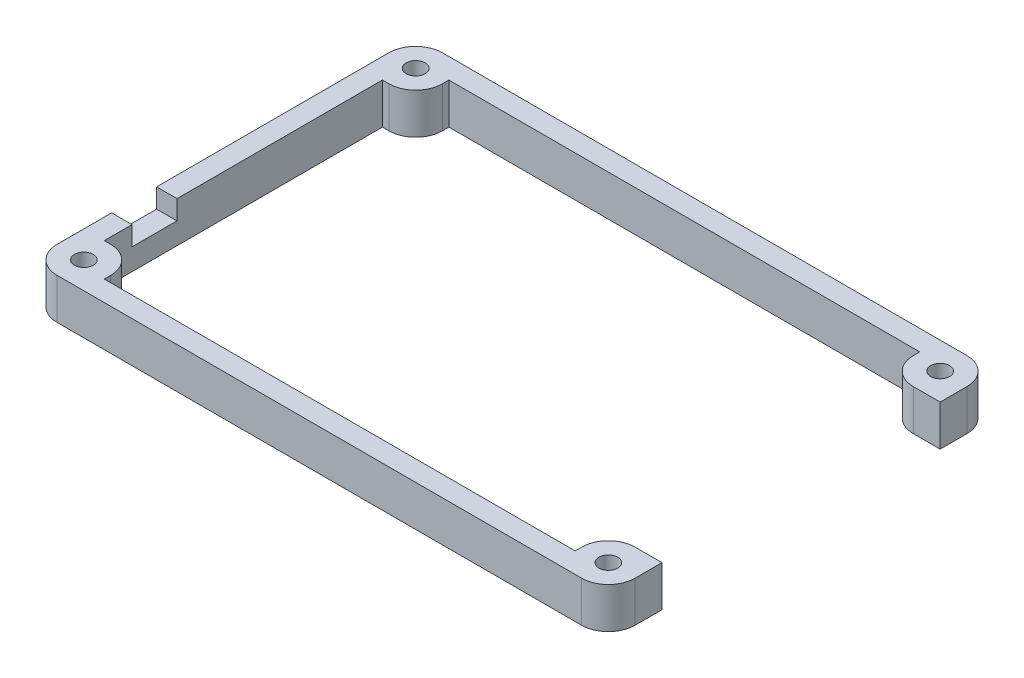
ISO-10303-21;
HEADER;
FILE_DESCRIPTION(('STEP AP214'),'2;1');
FILE_NAME('part.step','',(''),(''),'','','');
FILE_SCHEMA(('AUTOMOTIVE_DESIGN { 1 0 10303 214 1 1 1 1 }'));
ENDSEC;
DATA;
#1=APPLICATION_CONTEXT('core data for automotive mechanical design processes');
#2=APPLICATION_PROTOCOL_DEFINITION('international standard','automotive_design',2000,#1);
#3=PRODUCT_CONTEXT('',#1,'mechanical');
#4=PRODUCT('Part','Part','',(#3));
#5=PRODUCT_RELATED_PRODUCT_CATEGORY('part','',(#4));
#6=PRODUCT_DEFINITION_FORMATION('','',#4);
#7=PRODUCT_DEFINITION_CONTEXT('part definition',#1,'design');
#8=PRODUCT_DEFINITION('design','',#6,#7);
#9=PRODUCT_DEFINITION_SHAPE('','',#8);
#10=(LENGTH_UNIT() NAMED_UNIT(*) SI_UNIT(.MILLI.,.METRE.));
#11=(NAMED_UNIT(*) PLANE_ANGLE_UNIT() SI_UNIT($,.RADIAN.));
#12=(NAMED_UNIT(*) SI_UNIT($,.STERADIAN.) SOLID_ANGLE_UNIT());
#13=UNCERTAINTY_MEASURE_WITH_UNIT(LENGTH_MEASURE(1.E-05),#10,'distance_accuracy_value','');
#14=(GEOMETRIC_REPRESENTATION_CONTEXT(3) GLOBAL_UNCERTAINTY_ASSIGNED_CONTEXT((#13)) GLOBAL_UNIT_ASSIGNED_CONTEXT((#10,
#11,#12)) REPRESENTATION_CONTEXT('',''));
#15=CARTESIAN_POINT('',(0.,0.,0.));
#16=DIRECTION('',(0.,0.,1.));
#17=DIRECTION('',(1.,0.,0.));
#18=AXIS2_PLACEMENT_3D('',#15,#16,#17);
#19=CARTESIAN_POINT('',(-40.825,6.35,-25.825));
#20=DIRECTION('',(0.,1.,0.));
#21=DIRECTION('',(0.,0.,1.));
#22=AXIS2_PLACEMENT_3D('',#19,#20,#21);
#23=PLANE('',#22);
#24=DIRECTION('',(-1.,0.,0.));
#25=VECTOR('',#24,1.);
#26=CARTESIAN_POINT('',(40.825,6.35,-21.65));
#27=LINE('',#26,#25);
#28=CARTESIAN_POINT('',(45.,6.35,-21.65));
#29=VERTEX_POINT('',#28);
#30=CARTESIAN_POINT('',(40.825,6.35,-21.65));
#31=VERTEX_POINT('',#30);
#32=EDGE_CURVE('E374',#29,#31,#27,.T.);
#33=ORIENTED_EDGE('',*,*,#32,.F.);
#34=DIRECTION('',(0.,0.,-1.));
#35=VECTOR('',#34,1.);
#36=CARTESIAN_POINT('',(45.,6.35,-25.825));
#37=LINE('',#36,#35);
#38=CARTESIAN_POINT('',(45.,6.35,-25.825));
#39=VERTEX_POINT('',#38);
#40=EDGE_CURVE('E323',#29,#39,#37,.T.);
#41=ORIENTED_EDGE('',*,*,#40,.T.);
#42=CARTESIAN_POINT('',(40.825,6.35,-25.825));
#43=DIRECTION('',(0.,1.,0.));
#44=DIRECTION('',(0.,0.,1.));
#45=AXIS2_PLACEMENT_3D('',#42,#43,#44);
#46=CIRCLE('',#45,4.175);
#47=CARTESIAN_POINT('',(40.825,6.35,-30.));
#48=VERTEX_POINT('',#47);
#49=EDGE_CURVE('E329',#39,#48,#46,.T.);
#50=ORIENTED_EDGE('',*,*,#49,.T.);
#51=DIRECTION('',(-1.,0.,0.));
#52=VECTOR('',#51,1.);
#53=CARTESIAN_POINT('',(-40.825,6.35,-30.));
#54=LINE('',#53,#52);
#55=CARTESIAN_POINT('',(-40.825,6.35,-30.));
#56=VERTEX_POINT('',#55);
#57=EDGE_CURVE('E262',#48,#56,#54,.T.);
#58=ORIENTED_EDGE('',*,*,#57,.T.);
#59=CARTESIAN_POINT('',(-40.825,6.35,-25.825));
#60=DIRECTION('',(0.,1.,0.));
#61=DIRECTION('',(0.,0.,1.));
#62=AXIS2_PLACEMENT_3D('',#59,#60,#61);
#63=CIRCLE('',#62,4.17499999999999);
#64=CARTESIAN_POINT('',(-45.,6.35,-25.825));
#65=VERTEX_POINT('',#64);
#66=EDGE_CURVE('E257',#56,#65,#63,.T.);
#67=ORIENTED_EDGE('',*,*,#66,.T.);
#68=DIRECTION('',(0.,0.,1.));
#69=VECTOR('',#68,1.);
#70=CARTESIAN_POINT('',(-45.,6.35,-25.825));
#71=LINE('',#70,#69);
#72=CARTESIAN_POINT('',(-45.,6.35,10.325));
#73=VERTEX_POINT('',#72);
#74=EDGE_CURVE('E287',#65,#73,#71,.T.);
#75=ORIENTED_EDGE('',*,*,#74,.T.);
#76=DIRECTION('',(-1.,0.,0.));
#77=VECTOR('',#76,1.);
#78=CARTESIAN_POINT('',(-40.825,6.35,10.325));
#79=LINE('',#78,#77);
#80=CARTESIAN_POINT('',(-41.825,6.35,10.325));
#81=VERTEX_POINT('',#80);
#82=EDGE_CURVE('E342',#81,#73,#79,.T.);
#83=ORIENTED_EDGE('',*,*,#82,.F.);
#84=DIRECTION('',(0.,0.,1.));
#85=VECTOR('',#84,1.);
#86=CARTESIAN_POINT('',(-41.825,6.35,-21.65));
#87=LINE('',#86,#85);
#88=CARTESIAN_POINT('',(-41.825,6.35,-21.65));
#89=VERTEX_POINT('',#88);
#90=EDGE_CURVE('E345',#89,#81,#87,.T.);
#91=ORIENTED_EDGE('',*,*,#90,.F.);
#92=DIRECTION('',(-1.,0.,0.));
#93=VECTOR('',#92,1.);
#94=CARTESIAN_POINT('',(-40.825,6.35,-21.65));
#95=LINE('',#94,#93);
#96=CARTESIAN_POINT('',(-40.825,6.35,-21.65));
#97=VERTEX_POINT('',#96);
#98=EDGE_CURVE('E360',#97,#89,#95,.T.);
#99=ORIENTED_EDGE('',*,*,#98,.F.);
#100=CARTESIAN_POINT('',(-40.825,6.35,-25.825));
#101=DIRECTION('',(0.,-1.,0.));
#102=DIRECTION('',(0.,0.,1.));
#103=AXIS2_PLACEMENT_3D('',#100,#101,#102);
#104=CIRCLE('',#103,4.175);
#105=CARTESIAN_POINT('',(-36.65,6.35,-25.825));
#106=VERTEX_POINT('',#105);
#107=EDGE_CURVE('E504',#106,#97,#104,.T.);
#108=ORIENTED_EDGE('',*,*,#107,.F.);
#109=DIRECTION('',(0.,0.,1.));
#110=VECTOR('',#109,1.);
#111=CARTESIAN_POINT('',(-36.65,6.35,-25.825));
#112=LINE('',#111,#110);
#113=CARTESIAN_POINT('',(-36.65,6.35,-26.825));
#114=VERTEX_POINT('',#113);
#115=EDGE_CURVE('E503',#114,#106,#112,.T.);
#116=ORIENTED_EDGE('',*,*,#115,.F.);
#117=DIRECTION('',(-1.,0.,0.));
#118=VECTOR('',#117,1.);
#119=CARTESIAN_POINT('',(-36.65,6.35,-26.825));
#120=LINE('',#119,#118);
#121=CARTESIAN_POINT('',(36.65,6.35,-26.825));
#122=VERTEX_POINT('',#121);
#123=EDGE_CURVE('E501',#122,#114,#120,.T.);
#124=ORIENTED_EDGE('',*,*,#123,.F.);
#125=DIRECTION('',(0.,0.,-1.));
#126=VECTOR('',#125,1.);
#127=CARTESIAN_POINT('',(36.65,6.35,-25.825));
#128=LINE('',#127,#126);
#129=CARTESIAN_POINT('',(36.65,6.35,-25.825));
#130=VERTEX_POINT('',#129);
#131=EDGE_CURVE('E441',#130,#122,#128,.T.);
#132=ORIENTED_EDGE('',*,*,#131,.F.);
#133=CARTESIAN_POINT('',(40.825,6.35,-25.825));
#134=DIRECTION('',(0.,-1.,0.));
#135=DIRECTION('',(0.,0.,1.));
#136=AXIS2_PLACEMENT_3D('',#133,#134,#135);
#137=CIRCLE('',#136,4.175);
#138=EDGE_CURVE('E413',#31,#130,#137,.T.);
#139=ORIENTED_EDGE('',*,*,#138,.F.);
#140=EDGE_LOOP('',(#33,#41,#50,#58,#67,#75,#83,#91,#99,#108,#116,#124,#132,#139));
#141=FACE_BOUND('',#140,.T.);
#142=CARTESIAN_POINT('',(-40.825,6.35,-25.825));
#143=DIRECTION('',(0.,1.,0.));
#144=DIRECTION('',(0.,0.,1.));
#145=AXIS2_PLACEMENT_3D('',#142,#143,#144);
#146=CIRCLE('',#145,1.4732);
#147=CARTESIAN_POINT('',(-40.825,6.35,-24.3518));
#148=VERTEX_POINT('',#147);
#149=EDGE_CURVE('E479',#148,#148,#146,.T.);
#150=ORIENTED_EDGE('',*,*,#149,.F.);
#151=EDGE_LOOP('',(#150));
#152=FACE_BOUND('',#151,.T.);
#153=CARTESIAN_POINT('',(40.825,6.35,-25.825));
#154=DIRECTION('',(0.,1.,0.));
#155=DIRECTION('',(0.,0.,1.));
#156=AXIS2_PLACEMENT_3D('',#153,#154,#155);
#157=CIRCLE('',#156,1.4732);
#158=CARTESIAN_POINT('',(40.825,6.35,-24.3518));
#159=VERTEX_POINT('',#158);
#160=EDGE_CURVE('E459',#159,#159,#157,.T.);
#161=ORIENTED_EDGE('',*,*,#160,.F.);
#162=EDGE_LOOP('',(#161));
#163=FACE_BOUND('',#162,.T.);
#164=ADVANCED_FACE('F32',(#141,#152,#163),#23,.T.);
#165=CARTESIAN_POINT('',(45.,6.35,-25.825));
#166=DIRECTION('',(-1.,0.,0.));
#167=DIRECTION('',(0.,0.,1.));
#168=AXIS2_PLACEMENT_3D('',#165,#166,#167);
#169=PLANE('',#168);
#170=ORIENTED_EDGE('',*,*,#40,.F.);
#171=DIRECTION('',(0.,1.,0.));
#172=VECTOR('',#171,1.);
#173=CARTESIAN_POINT('',(45.,0.,-21.65));
#174=LINE('',#173,#172);
#175=CARTESIAN_POINT('',(45.,0.,-21.65));
#176=VERTEX_POINT('',#175);
#177=EDGE_CURVE('E241',#176,#29,#174,.T.);
#178=ORIENTED_EDGE('',*,*,#177,.F.);
#179=DIRECTION('',(0.,0.,-1.));
#180=VECTOR('',#179,1.);
#181=CARTESIAN_POINT('',(45.,0.,-25.825));
#182=LINE('',#181,#180);
#183=CARTESIAN_POINT('',(45.,0.,-25.825));
#184=VERTEX_POINT('',#183);
#185=EDGE_CURVE('E248',#176,#184,#182,.T.);
#186=ORIENTED_EDGE('',*,*,#185,.T.);
#187=DIRECTION('',(0.,-1.,0.));
#188=VECTOR('',#187,1.);
#189=CARTESIAN_POINT('',(45.,6.35,-25.825));
#190=LINE('',#189,#188);
#191=EDGE_CURVE('E265',#39,#184,#190,.T.);
#192=ORIENTED_EDGE('',*,*,#191,.F.);
#193=EDGE_LOOP('',(#170,#178,#186,#192));
#194=FACE_BOUND('',#193,.T.);
#195=ADVANCED_FACE('F454',(#194),#169,.F.);
#196=CARTESIAN_POINT('',(45.,6.35,25.825));
#197=VERTEX_POINT('',#196);
#198=CARTESIAN_POINT('',(45.,6.35,21.65));
#199=VERTEX_POINT('',#198);
#200=EDGE_CURVE('E328',#197,#199,#37,.T.);
#201=ORIENTED_EDGE('',*,*,#200,.T.);
#202=DIRECTION('',(1.,0.,0.));
#203=VECTOR('',#202,1.);
#204=CARTESIAN_POINT('',(40.825,6.35,21.65));
#205=LINE('',#204,#203);
#206=CARTESIAN_POINT('',(40.825,6.35,21.65));
#207=VERTEX_POINT('',#206);
#208=EDGE_CURVE('E237',#207,#199,#205,.T.);
#209=ORIENTED_EDGE('',*,*,#208,.F.);
#210=CARTESIAN_POINT('',(40.825,6.35,25.825));
#211=DIRECTION('',(0.,-1.,0.));
#212=DIRECTION('',(0.,0.,1.));
#213=AXIS2_PLACEMENT_3D('',#210,#211,#212);
#214=CIRCLE('',#213,4.175);
#215=CARTESIAN_POINT('',(36.65,6.35,25.825));
#216=VERTEX_POINT('',#215);
#217=EDGE_CURVE('E371',#216,#207,#214,.T.);
#218=ORIENTED_EDGE('',*,*,#217,.F.);
#219=DIRECTION('',(0.,0.,-1.));
#220=VECTOR('',#219,1.);
#221=CARTESIAN_POINT('',(36.65,6.35,25.825));
#222=LINE('',#221,#220);
#223=CARTESIAN_POINT('',(36.65,6.35,26.825));
#224=VERTEX_POINT('',#223);
#225=EDGE_CURVE('E369',#224,#216,#222,.T.);
#226=ORIENTED_EDGE('',*,*,#225,.F.);
#227=DIRECTION('',(1.,0.,0.));
#228=VECTOR('',#227,1.);
#229=CARTESIAN_POINT('',(-36.65,6.35,26.825));
#230=LINE('',#229,#228);
#231=CARTESIAN_POINT('',(-36.65,6.35,26.825));
#232=VERTEX_POINT('',#231);
#233=EDGE_CURVE('E367',#232,#224,#230,.T.);
#234=ORIENTED_EDGE('',*,*,#233,.F.);
#235=DIRECTION('',(0.,0.,1.));
#236=VECTOR('',#235,1.);
#237=CARTESIAN_POINT('',(-36.65,6.35,25.825));
#238=LINE('',#237,#236);
#239=CARTESIAN_POINT('',(-36.65,6.35,25.825));
#240=VERTEX_POINT('',#239);
#241=EDGE_CURVE('E365',#240,#232,#238,.T.);
#242=ORIENTED_EDGE('',*,*,#241,.F.);
#243=CARTESIAN_POINT('',(-40.825,6.35,25.825));
#244=DIRECTION('',(0.,-1.,0.));
#245=DIRECTION('',(0.,0.,1.));
#246=AXIS2_PLACEMENT_3D('',#243,#244,#245);
#247=CIRCLE('',#246,4.17499999999999);
#248=CARTESIAN_POINT('',(-40.825,6.35,21.65));
#249=VERTEX_POINT('',#248);
#250=EDGE_CURVE('E358',#249,#240,#247,.T.);
#251=ORIENTED_EDGE('',*,*,#250,.F.);
#252=DIRECTION('',(1.,0.,0.));
#253=VECTOR('',#252,1.);
#254=CARTESIAN_POINT('',(-40.825,6.35,21.65));
#255=LINE('',#254,#253);
#256=CARTESIAN_POINT('',(-41.825,6.35,21.65));
#257=VERTEX_POINT('',#256);
#258=EDGE_CURVE('E355',#257,#249,#255,.T.);
#259=ORIENTED_EDGE('',*,*,#258,.F.);
#260=CARTESIAN_POINT('',(-41.825,6.35,17.325));
#261=VERTEX_POINT('',#260);
#262=EDGE_CURVE('E356',#261,#257,#87,.T.);
#263=ORIENTED_EDGE('',*,*,#262,.F.);
#264=DIRECTION('',(1.,0.,0.));
#265=VECTOR('',#264,1.);
#266=CARTESIAN_POINT('',(-40.825,6.35,17.325));
#267=LINE('',#266,#265);
#268=CARTESIAN_POINT('',(-45.,6.35,17.325));
#269=VERTEX_POINT('',#268);
#270=EDGE_CURVE('E47',#269,#261,#267,.T.);
#271=ORIENTED_EDGE('',*,*,#270,.F.);
#272=CARTESIAN_POINT('',(-45.,6.35,25.825));
#273=VERTEX_POINT('',#272);
#274=EDGE_CURVE('E337',#269,#273,#71,.T.);
#275=ORIENTED_EDGE('',*,*,#274,.T.);
#276=CARTESIAN_POINT('',(-40.825,6.35,25.825));
#277=DIRECTION('',(0.,1.,0.));
#278=DIRECTION('',(0.,0.,1.));
#279=AXIS2_PLACEMENT_3D('',#276,#277,#278);
#280=CIRCLE('',#279,4.17500000000001);
#281=CARTESIAN_POINT('',(-40.825,6.35,30.));
#282=VERTEX_POINT('',#281);
#283=EDGE_CURVE('E321',#273,#282,#280,.T.);
#284=ORIENTED_EDGE('',*,*,#283,.T.);
#285=DIRECTION('',(1.,0.,0.));
#286=VECTOR('',#285,1.);
#287=CARTESIAN_POINT('',(-40.825,6.35,30.));
#288=LINE('',#287,#286);
#289=CARTESIAN_POINT('',(40.825,6.35,30.));
#290=VERTEX_POINT('',#289);
#291=EDGE_CURVE('E318',#282,#290,#288,.T.);
#292=ORIENTED_EDGE('',*,*,#291,.T.);
#293=CARTESIAN_POINT('',(40.825,6.35,25.825));
#294=DIRECTION('',(0.,1.,0.));
#295=DIRECTION('',(0.,0.,1.));
#296=AXIS2_PLACEMENT_3D('',#293,#294,#295);
#297=CIRCLE('',#296,4.17499999999999);
#298=EDGE_CURVE('E320',#290,#197,#297,.T.);
#299=ORIENTED_EDGE('',*,*,#298,.T.);
#300=EDGE_LOOP('',(#201,#209,#218,#226,#234,#242,#251,#259,#263,#271,#275,#284,#292,#299));
#301=FACE_BOUND('',#300,.T.);
#302=CARTESIAN_POINT('',(40.825,6.35,25.825));
#303=DIRECTION('',(0.,1.,0.));
#304=DIRECTION('',(0.,0.,1.));
#305=AXIS2_PLACEMENT_3D('',#302,#303,#304);
#306=CIRCLE('',#305,1.4732);
#307=CARTESIAN_POINT('',(40.825,6.35,27.2982));
#308=VERTEX_POINT('',#307);
#309=EDGE_CURVE('E467',#308,#308,#306,.T.);
#310=ORIENTED_EDGE('',*,*,#309,.F.);
#311=EDGE_LOOP('',(#310));
#312=FACE_BOUND('',#311,.T.);
#313=CARTESIAN_POINT('',(-40.825,6.35,25.825));
#314=DIRECTION('',(0.,1.,0.));
#315=DIRECTION('',(0.,0.,1.));
#316=AXIS2_PLACEMENT_3D('',#313,#314,#315);
#317=CIRCLE('',#316,1.4732);
#318=CARTESIAN_POINT('',(-40.825,6.35,27.2982));
#319=VERTEX_POINT('',#318);
#320=EDGE_CURVE('E473',#319,#319,#317,.T.);
#321=ORIENTED_EDGE('',*,*,#320,.F.);
#322=EDGE_LOOP('',(#321));
#323=FACE_BOUND('',#322,.T.);
#324=ADVANCED_FACE('F547',(#301,#312,#323),#23,.T.);
#325=CARTESIAN_POINT('',(-40.825,0.,-25.825));
#326=DIRECTION('',(0.,1.,0.));
#327=DIRECTION('',(0.,0.,1.));
#328=AXIS2_PLACEMENT_3D('',#325,#326,#327);
#329=PLANE('',#328);
#330=CARTESIAN_POINT('',(40.825,0.,-25.825));
#331=DIRECTION('',(0.,-1.,0.));
#332=DIRECTION('',(0.,0.,-1.));
#333=AXIS2_PLACEMENT_3D('',#330,#331,#332);
#334=CIRCLE('',#333,1.4732);
#335=CARTESIAN_POINT('',(40.825,0.,-27.2982));
#336=VERTEX_POINT('',#335);
#337=EDGE_CURVE('E456',#336,#336,#334,.T.);
#338=ORIENTED_EDGE('',*,*,#337,.F.);
#339=EDGE_LOOP('',(#338));
#340=FACE_BOUND('',#339,.T.);
#341=CARTESIAN_POINT('',(40.825,0.,25.825));
#342=DIRECTION('',(0.,-1.,0.));
#343=DIRECTION('',(0.,0.,-1.));
#344=AXIS2_PLACEMENT_3D('',#341,#342,#343);
#345=CIRCLE('',#344,1.4732);
#346=CARTESIAN_POINT('',(40.825,0.,24.3518));
#347=VERTEX_POINT('',#346);
#348=EDGE_CURVE('E464',#347,#347,#345,.T.);
#349=ORIENTED_EDGE('',*,*,#348,.F.);
#350=EDGE_LOOP('',(#349));
#351=FACE_BOUND('',#350,.T.);
#352=CARTESIAN_POINT('',(-40.825,0.,25.825));
#353=DIRECTION('',(0.,-1.,0.));
#354=DIRECTION('',(0.,0.,-1.));
#355=AXIS2_PLACEMENT_3D('',#352,#353,#354);
#356=CIRCLE('',#355,1.4732);
#357=CARTESIAN_POINT('',(-40.825,0.,24.3518));
#358=VERTEX_POINT('',#357);
#359=EDGE_CURVE('E470',#358,#358,#356,.T.);
#360=ORIENTED_EDGE('',*,*,#359,.F.);
#361=EDGE_LOOP('',(#360));
#362=FACE_BOUND('',#361,.T.);
#363=CARTESIAN_POINT('',(-40.825,0.,-25.825));
#364=DIRECTION('',(0.,-1.,0.));
#365=DIRECTION('',(0.,0.,-1.));
#366=AXIS2_PLACEMENT_3D('',#363,#364,#365);
#367=CIRCLE('',#366,1.4732);
#368=CARTESIAN_POINT('',(-40.825,0.,-27.2982));
#369=VERTEX_POINT('',#368);
#370=EDGE_CURVE('E476',#369,#369,#367,.T.);
#371=ORIENTED_EDGE('',*,*,#370,.F.);
#372=EDGE_LOOP('',(#371));
#373=FACE_BOUND('',#372,.T.);
#374=ORIENTED_EDGE('',*,*,#185,.F.);
#375=DIRECTION('',(-1.,0.,0.));
#376=VECTOR('',#375,1.);
#377=CARTESIAN_POINT('',(40.825,0.,-21.65));
#378=LINE('',#377,#376);
#379=CARTESIAN_POINT('',(40.825,0.,-21.65));
#380=VERTEX_POINT('',#379);
#381=EDGE_CURVE('E231',#176,#380,#378,.T.);
#382=ORIENTED_EDGE('',*,*,#381,.T.);
#383=CARTESIAN_POINT('',(40.825,0.,-25.825));
#384=DIRECTION('',(0.,-1.,0.));
#385=DIRECTION('',(0.,0.,1.));
#386=AXIS2_PLACEMENT_3D('',#383,#384,#385);
#387=CIRCLE('',#386,4.175);
#388=CARTESIAN_POINT('',(36.65,0.,-25.825));
#389=VERTEX_POINT('',#388);
#390=EDGE_CURVE('E55',#380,#389,#387,.T.);
#391=ORIENTED_EDGE('',*,*,#390,.T.);
#392=DIRECTION('',(0.,0.,-1.));
#393=VECTOR('',#392,1.);
#394=CARTESIAN_POINT('',(36.65,0.,-25.825));
#395=LINE('',#394,#393);
#396=CARTESIAN_POINT('',(36.65,0.,-26.825));
#397=VERTEX_POINT('',#396);
#398=EDGE_CURVE('E378',#389,#397,#395,.T.);
#399=ORIENTED_EDGE('',*,*,#398,.T.);
#400=DIRECTION('',(-1.,0.,0.));
#401=VECTOR('',#400,1.);
#402=CARTESIAN_POINT('',(-36.65,0.,-26.825));
#403=LINE('',#402,#401);
#404=CARTESIAN_POINT('',(-36.65,0.,-26.825));
#405=VERTEX_POINT('',#404);
#406=EDGE_CURVE('E381',#397,#405,#403,.T.);
#407=ORIENTED_EDGE('',*,*,#406,.T.);
#408=DIRECTION('',(0.,0.,1.));
#409=VECTOR('',#408,1.);
#410=CARTESIAN_POINT('',(-36.65,0.,-25.825));
#411=LINE('',#410,#409);
#412=CARTESIAN_POINT('',(-36.65,0.,-25.825));
#413=VERTEX_POINT('',#412);
#414=EDGE_CURVE('E384',#405,#413,#411,.T.);
#415=ORIENTED_EDGE('',*,*,#414,.T.);
#416=CARTESIAN_POINT('',(-40.825,0.,-25.825));
#417=DIRECTION('',(0.,-1.,0.));
#418=DIRECTION('',(0.,0.,1.));
#419=AXIS2_PLACEMENT_3D('',#416,#417,#418);
#420=CIRCLE('',#419,4.175);
#421=CARTESIAN_POINT('',(-40.825,0.,-21.65));
#422=VERTEX_POINT('',#421);
#423=EDGE_CURVE('E387',#413,#422,#420,.T.);
#424=ORIENTED_EDGE('',*,*,#423,.T.);
#425=DIRECTION('',(-1.,0.,0.));
#426=VECTOR('',#425,1.);
#427=CARTESIAN_POINT('',(-40.825,0.,-21.65));
#428=LINE('',#427,#426);
#429=CARTESIAN_POINT('',(-41.825,0.,-21.65));
#430=VERTEX_POINT('',#429);
#431=EDGE_CURVE('E390',#422,#430,#428,.T.);
#432=ORIENTED_EDGE('',*,*,#431,.T.);
#433=DIRECTION('',(0.,0.,1.));
#434=VECTOR('',#433,1.);
#435=CARTESIAN_POINT('',(-41.825,0.,-21.65));
#436=LINE('',#435,#434);
#437=CARTESIAN_POINT('',(-41.825,0.,21.65));
#438=VERTEX_POINT('',#437);
#439=EDGE_CURVE('E393',#430,#438,#436,.T.);
#440=ORIENTED_EDGE('',*,*,#439,.T.);
#441=DIRECTION('',(1.,0.,0.));
#442=VECTOR('',#441,1.);
#443=CARTESIAN_POINT('',(-40.825,0.,21.65));
#444=LINE('',#443,#442);
#445=CARTESIAN_POINT('',(-40.825,0.,21.65));
#446=VERTEX_POINT('',#445);
#447=EDGE_CURVE('E396',#438,#446,#444,.T.);
#448=ORIENTED_EDGE('',*,*,#447,.T.);
#449=CARTESIAN_POINT('',(-40.825,0.,25.825));
#450=DIRECTION('',(0.,-1.,0.));
#451=DIRECTION('',(0.,0.,1.));
#452=AXIS2_PLACEMENT_3D('',#449,#450,#451);
#453=CIRCLE('',#452,4.17499999999999);
#454=CARTESIAN_POINT('',(-36.65,0.,25.825));
#455=VERTEX_POINT('',#454);
#456=EDGE_CURVE('E399',#446,#455,#453,.T.);
#457=ORIENTED_EDGE('',*,*,#456,.T.);
#458=DIRECTION('',(0.,0.,1.));
#459=VECTOR('',#458,1.);
#460=CARTESIAN_POINT('',(-36.65,0.,25.825));
#461=LINE('',#460,#459);
#462=CARTESIAN_POINT('',(-36.65,0.,26.825));
#463=VERTEX_POINT('',#462);
#464=EDGE_CURVE('E402',#455,#463,#461,.T.);
#465=ORIENTED_EDGE('',*,*,#464,.T.);
#466=DIRECTION('',(1.,0.,0.));
#467=VECTOR('',#466,1.);
#468=CARTESIAN_POINT('',(-36.65,0.,26.825));
#469=LINE('',#468,#467);
#470=CARTESIAN_POINT('',(36.65,0.,26.825));
#471=VERTEX_POINT('',#470);
#472=EDGE_CURVE('E405',#463,#471,#469,.T.);
#473=ORIENTED_EDGE('',*,*,#472,.T.);
#474=DIRECTION('',(0.,0.,-1.));
#475=VECTOR('',#474,1.);
#476=CARTESIAN_POINT('',(36.65,0.,25.825));
#477=LINE('',#476,#475);
#478=CARTESIAN_POINT('',(36.65,0.,25.825));
#479=VERTEX_POINT('',#478);
#480=EDGE_CURVE('E408',#471,#479,#477,.T.);
#481=ORIENTED_EDGE('',*,*,#480,.T.);
#482=CARTESIAN_POINT('',(40.825,0.,25.825));
#483=DIRECTION('',(0.,-1.,0.));
#484=DIRECTION('',(0.,0.,1.));
#485=AXIS2_PLACEMENT_3D('',#482,#483,#484);
#486=CIRCLE('',#485,4.175);
#487=CARTESIAN_POINT('',(40.825,0.,21.65));
#488=VERTEX_POINT('',#487);
#489=EDGE_CURVE('E228',#479,#488,#486,.T.);
#490=ORIENTED_EDGE('',*,*,#489,.T.);
#491=DIRECTION('',(1.,0.,0.));
#492=VECTOR('',#491,1.);
#493=CARTESIAN_POINT('',(40.825,0.,21.65));
#494=LINE('',#493,#492);
#495=CARTESIAN_POINT('',(45.,0.,21.65));
#496=VERTEX_POINT('',#495);
#497=EDGE_CURVE('E219',#488,#496,#494,.T.);
#498=ORIENTED_EDGE('',*,*,#497,.T.);
#499=CARTESIAN_POINT('',(45.,0.,25.825));
#500=VERTEX_POINT('',#499);
#501=EDGE_CURVE('E225',#500,#496,#182,.T.);
#502=ORIENTED_EDGE('',*,*,#501,.F.);
#503=CARTESIAN_POINT('',(40.825,0.,25.825));
#504=DIRECTION('',(0.,1.,0.));
#505=DIRECTION('',(0.,0.,1.));
#506=AXIS2_PLACEMENT_3D('',#503,#504,#505);
#507=CIRCLE('',#506,4.17499999999999);
#508=CARTESIAN_POINT('',(40.825,0.,30.));
#509=VERTEX_POINT('',#508);
#510=EDGE_CURVE('E252',#509,#500,#507,.T.);
#511=ORIENTED_EDGE('',*,*,#510,.F.);
#512=DIRECTION('',(1.,0.,0.));
#513=VECTOR('',#512,1.);
#514=CARTESIAN_POINT('',(-40.825,0.,30.));
#515=LINE('',#514,#513);
#516=CARTESIAN_POINT('',(-40.825,0.,30.));
#517=VERTEX_POINT('',#516);
#518=EDGE_CURVE('E304',#517,#509,#515,.T.);
#519=ORIENTED_EDGE('',*,*,#518,.F.);
#520=CARTESIAN_POINT('',(-40.825,0.,25.825));
#521=DIRECTION('',(0.,1.,0.));
#522=DIRECTION('',(0.,0.,1.));
#523=AXIS2_PLACEMENT_3D('',#520,#521,#522);
#524=CIRCLE('',#523,4.17500000000001);
#525=CARTESIAN_POINT('',(-45.,0.,25.825));
#526=VERTEX_POINT('',#525);
#527=EDGE_CURVE('E297',#526,#517,#524,.T.);
#528=ORIENTED_EDGE('',*,*,#527,.F.);
#529=DIRECTION('',(0.,0.,1.));
#530=VECTOR('',#529,1.);
#531=CARTESIAN_POINT('',(-45.,0.,-25.825));
#532=LINE('',#531,#530);
#533=CARTESIAN_POINT('',(-45.,0.,-25.825));
#534=VERTEX_POINT('',#533);
#535=EDGE_CURVE('E284',#534,#526,#532,.T.);
#536=ORIENTED_EDGE('',*,*,#535,.F.);
#537=CARTESIAN_POINT('',(-40.825,0.,-25.825));
#538=DIRECTION('',(0.,1.,0.));
#539=DIRECTION('',(0.,0.,1.));
#540=AXIS2_PLACEMENT_3D('',#537,#538,#539);
#541=CIRCLE('',#540,4.17499999999999);
#542=CARTESIAN_POINT('',(-40.825,0.,-30.));
#543=VERTEX_POINT('',#542);
#544=EDGE_CURVE('E292',#543,#534,#541,.T.);
#545=ORIENTED_EDGE('',*,*,#544,.F.);
#546=DIRECTION('',(-1.,0.,0.));
#547=VECTOR('',#546,1.);
#548=CARTESIAN_POINT('',(-40.825,0.,-30.));
#549=LINE('',#548,#547);
#550=CARTESIAN_POINT('',(40.825,0.,-30.));
#551=VERTEX_POINT('',#550);
#552=EDGE_CURVE('E250',#551,#543,#549,.T.);
#553=ORIENTED_EDGE('',*,*,#552,.F.);
#554=CARTESIAN_POINT('',(40.825,0.,-25.825));
#555=DIRECTION('',(0.,1.,0.));
#556=DIRECTION('',(0.,0.,1.));
#557=AXIS2_PLACEMENT_3D('',#554,#555,#556);
#558=CIRCLE('',#557,4.175);
#559=EDGE_CURVE('E247',#184,#551,#558,.T.);
#560=ORIENTED_EDGE('',*,*,#559,.F.);
#561=EDGE_LOOP('',(#374,#382,#391,#399,#407,#415,#424,#432,#440,#448,#457,#465,#473,#481,#490,
#498,#502,#511,#519,#528,#536,#545,#553,#560));
#562=FACE_BOUND('',#561,.T.);
#563=ADVANCED_FACE('F222',(#340,#351,#362,#373,#562),#329,.F.);
#564=CARTESIAN_POINT('',(-40.825,6.35,-25.825));
#565=DIRECTION('',(0.,-1.,0.));
#566=DIRECTION('',(0.,0.,-1.));
#567=AXIS2_PLACEMENT_3D('',#564,#565,#566);
#568=CYLINDRICAL_SURFACE('',#567,4.17499999999999);
#569=ORIENTED_EDGE('',*,*,#544,.T.);
#570=DIRECTION('',(0.,-1.,0.));
#571=VECTOR('',#570,1.);
#572=CARTESIAN_POINT('',(-45.,6.35,-25.825));
#573=LINE('',#572,#571);
#574=EDGE_CURVE('E40',#65,#534,#573,.T.);
#575=ORIENTED_EDGE('',*,*,#574,.F.);
#576=ORIENTED_EDGE('',*,*,#66,.F.);
#577=DIRECTION('',(0.,-1.,0.));
#578=VECTOR('',#577,1.);
#579=CARTESIAN_POINT('',(-40.825,6.35,-30.));
#580=LINE('',#579,#578);
#581=EDGE_CURVE('E258',#56,#543,#580,.T.);
#582=ORIENTED_EDGE('',*,*,#581,.T.);
#583=EDGE_LOOP('',(#569,#575,#576,#582));
#584=FACE_BOUND('',#583,.T.);
#585=ADVANCED_FACE('F34',(#584),#568,.T.);
#586=CARTESIAN_POINT('',(-45.,6.35,-25.825));
#587=DIRECTION('',(1.,0.,0.));
#588=DIRECTION('',(0.,0.,-1.));
#589=AXIS2_PLACEMENT_3D('',#586,#587,#588);
#590=PLANE('',#589);
#591=DIRECTION('',(0.,0.,1.));
#592=VECTOR('',#591,1.);
#593=CARTESIAN_POINT('',(-45.,3.35,10.325));
#594=LINE('',#593,#592);
#595=CARTESIAN_POINT('',(-45.,3.35,10.325));
#596=VERTEX_POINT('',#595);
#597=CARTESIAN_POINT('',(-45.,3.35,17.325));
#598=VERTEX_POINT('',#597);
#599=EDGE_CURVE('E483',#596,#598,#594,.T.);
#600=ORIENTED_EDGE('',*,*,#599,.F.);
#601=DIRECTION('',(0.,-1.,0.));
#602=VECTOR('',#601,1.);
#603=CARTESIAN_POINT('',(-45.,9.35,10.325));
#604=LINE('',#603,#602);
#605=EDGE_CURVE('E487',#73,#596,#604,.T.);
#606=ORIENTED_EDGE('',*,*,#605,.F.);
#607=ORIENTED_EDGE('',*,*,#74,.F.);
#608=ORIENTED_EDGE('',*,*,#574,.T.);
#609=ORIENTED_EDGE('',*,*,#535,.T.);
#610=DIRECTION('',(0.,-1.,0.));
#611=VECTOR('',#610,1.);
#612=CARTESIAN_POINT('',(-45.,6.35,25.825));
#613=LINE('',#612,#611);
#614=EDGE_CURVE('E275',#273,#526,#613,.T.);
#615=ORIENTED_EDGE('',*,*,#614,.F.);
#616=ORIENTED_EDGE('',*,*,#274,.F.);
#617=DIRECTION('',(0.,1.,0.));
#618=VECTOR('',#617,1.);
#619=CARTESIAN_POINT('',(-45.,9.35,17.325));
#620=LINE('',#619,#618);
#621=EDGE_CURVE('E482',#598,#269,#620,.T.);
#622=ORIENTED_EDGE('',*,*,#621,.F.);
#623=EDGE_LOOP('',(#600,#606,#607,#608,#609,#615,#616,#622));
#624=FACE_BOUND('',#623,.T.);
#625=ADVANCED_FACE('F282',(#624),#590,.F.);
#626=CARTESIAN_POINT('',(-40.825,6.35,25.825));
#627=DIRECTION('',(0.,-1.,0.));
#628=DIRECTION('',(0.,0.,-1.));
#629=AXIS2_PLACEMENT_3D('',#626,#627,#628);
#630=CYLINDRICAL_SURFACE('',#629,4.17500000000001);
#631=ORIENTED_EDGE('',*,*,#527,.T.);
#632=DIRECTION('',(0.,-1.,0.));
#633=VECTOR('',#632,1.);
#634=CARTESIAN_POINT('',(-40.825,6.35,30.));
#635=LINE('',#634,#633);
#636=EDGE_CURVE('E272',#282,#517,#635,.T.);
#637=ORIENTED_EDGE('',*,*,#636,.F.);
#638=ORIENTED_EDGE('',*,*,#283,.F.);
#639=ORIENTED_EDGE('',*,*,#614,.T.);
#640=EDGE_LOOP('',(#631,#637,#638,#639));
#641=FACE_BOUND('',#640,.T.);
#642=ADVANCED_FACE('F314',(#641),#630,.T.);
#643=CARTESIAN_POINT('',(-40.825,6.35,30.));
#644=DIRECTION('',(0.,0.,-1.));
#645=DIRECTION('',(-1.,0.,0.));
#646=AXIS2_PLACEMENT_3D('',#643,#644,#645);
#647=PLANE('',#646);
#648=ORIENTED_EDGE('',*,*,#518,.T.);
#649=DIRECTION('',(0.,-1.,0.));
#650=VECTOR('',#649,1.);
#651=CARTESIAN_POINT('',(40.825,6.35,30.));
#652=LINE('',#651,#650);
#653=EDGE_CURVE('E269',#290,#509,#652,.T.);
#654=ORIENTED_EDGE('',*,*,#653,.F.);
#655=ORIENTED_EDGE('',*,*,#291,.F.);
#656=ORIENTED_EDGE('',*,*,#636,.T.);
#657=EDGE_LOOP('',(#648,#654,#655,#656));
#658=FACE_BOUND('',#657,.T.);
#659=ADVANCED_FACE('F317',(#658),#647,.F.);
#660=CARTESIAN_POINT('',(40.825,6.35,25.825));
#661=DIRECTION('',(0.,-1.,0.));
#662=DIRECTION('',(0.,0.,-1.));
#663=AXIS2_PLACEMENT_3D('',#660,#661,#662);
#664=CYLINDRICAL_SURFACE('',#663,4.17499999999999);
#665=ORIENTED_EDGE('',*,*,#510,.T.);
#666=DIRECTION('',(0.,-1.,0.));
#667=VECTOR('',#666,1.);
#668=CARTESIAN_POINT('',(45.,6.35,25.825));
#669=LINE('',#668,#667);
#670=EDGE_CURVE('E246',#197,#500,#669,.T.);
#671=ORIENTED_EDGE('',*,*,#670,.F.);
#672=ORIENTED_EDGE('',*,*,#298,.F.);
#673=ORIENTED_EDGE('',*,*,#653,.T.);
#674=EDGE_LOOP('',(#665,#671,#672,#673));
#675=FACE_BOUND('',#674,.T.);
#676=ADVANCED_FACE('F309',(#675),#664,.T.);
#677=ORIENTED_EDGE('',*,*,#501,.T.);
#678=DIRECTION('',(0.,1.,0.));
#679=VECTOR('',#678,1.);
#680=CARTESIAN_POINT('',(45.,0.,21.65));
#681=LINE('',#680,#679);
#682=EDGE_CURVE('E234',#496,#199,#681,.T.);
#683=ORIENTED_EDGE('',*,*,#682,.T.);
#684=ORIENTED_EDGE('',*,*,#200,.F.);
#685=ORIENTED_EDGE('',*,*,#670,.T.);
#686=EDGE_LOOP('',(#677,#683,#684,#685));
#687=FACE_BOUND('',#686,.T.);
#688=ADVANCED_FACE('F244',(#687),#169,.F.);
#689=CARTESIAN_POINT('',(40.825,6.35,-25.825));
#690=DIRECTION('',(0.,-1.,0.));
#691=DIRECTION('',(0.,0.,-1.));
#692=AXIS2_PLACEMENT_3D('',#689,#690,#691);
#693=CYLINDRICAL_SURFACE('',#692,4.175);
#694=ORIENTED_EDGE('',*,*,#559,.T.);
#695=DIRECTION('',(0.,-1.,0.));
#696=VECTOR('',#695,1.);
#697=CARTESIAN_POINT('',(40.825,6.35,-30.));
#698=LINE('',#697,#696);
#699=EDGE_CURVE('E261',#48,#551,#698,.T.);
#700=ORIENTED_EDGE('',*,*,#699,.F.);
#701=ORIENTED_EDGE('',*,*,#49,.F.);
#702=ORIENTED_EDGE('',*,*,#191,.T.);
#703=EDGE_LOOP('',(#694,#700,#701,#702));
#704=FACE_BOUND('',#703,.T.);
#705=ADVANCED_FACE('F587',(#704),#693,.T.);
#706=CARTESIAN_POINT('',(-40.825,6.35,-30.));
#707=DIRECTION('',(0.,0.,1.));
#708=DIRECTION('',(1.,0.,0.));
#709=AXIS2_PLACEMENT_3D('',#706,#707,#708);
#710=PLANE('',#709);
#711=ORIENTED_EDGE('',*,*,#552,.T.);
#712=ORIENTED_EDGE('',*,*,#581,.F.);
#713=ORIENTED_EDGE('',*,*,#57,.F.);
#714=ORIENTED_EDGE('',*,*,#699,.T.);
#715=EDGE_LOOP('',(#711,#712,#713,#714));
#716=FACE_BOUND('',#715,.T.);
#717=ADVANCED_FACE('F336',(#716),#710,.F.);
#718=CARTESIAN_POINT('',(40.825,6.35,-25.825));
#719=DIRECTION('',(0.,-1.,0.));
#720=DIRECTION('',(0.,0.,-1.));
#721=AXIS2_PLACEMENT_3D('',#718,#719,#720);
#722=CYLINDRICAL_SURFACE('',#721,4.175);
#723=ORIENTED_EDGE('',*,*,#390,.F.);
#724=DIRECTION('',(0.,-1.,0.));
#725=VECTOR('',#724,1.);
#726=CARTESIAN_POINT('',(40.825,6.35,-21.65));
#727=LINE('',#726,#725);
#728=EDGE_CURVE('E376',#31,#380,#727,.T.);
#729=ORIENTED_EDGE('',*,*,#728,.F.);
#730=ORIENTED_EDGE('',*,*,#138,.T.);
#731=DIRECTION('',(0.,-1.,0.));
#732=VECTOR('',#731,1.);
#733=CARTESIAN_POINT('',(36.65,6.35,-25.825));
#734=LINE('',#733,#732);
#735=EDGE_CURVE('E295',#130,#389,#734,.T.);
#736=ORIENTED_EDGE('',*,*,#735,.T.);
#737=EDGE_LOOP('',(#723,#729,#730,#736));
#738=FACE_BOUND('',#737,.T.);
#739=ADVANCED_FACE('F586',(#738),#722,.T.);
#740=CARTESIAN_POINT('',(36.65,6.35,-25.825));
#741=DIRECTION('',(-1.,0.,0.));
#742=DIRECTION('',(0.,0.,1.));
#743=AXIS2_PLACEMENT_3D('',#740,#741,#742);
#744=PLANE('',#743);
#745=ORIENTED_EDGE('',*,*,#398,.F.);
#746=ORIENTED_EDGE('',*,*,#735,.F.);
#747=ORIENTED_EDGE('',*,*,#131,.T.);
#748=DIRECTION('',(0.,-1.,0.));
#749=VECTOR('',#748,1.);
#750=CARTESIAN_POINT('',(36.65,6.35,-26.825));
#751=LINE('',#750,#749);
#752=EDGE_CURVE('E299',#122,#397,#751,.T.);
#753=ORIENTED_EDGE('',*,*,#752,.T.);
#754=EDGE_LOOP('',(#745,#746,#747,#753));
#755=FACE_BOUND('',#754,.T.);
#756=ADVANCED_FACE('F438',(#755),#744,.T.);
#757=CARTESIAN_POINT('',(-36.65,6.35,-26.825));
#758=DIRECTION('',(0.,0.,1.));
#759=DIRECTION('',(1.,0.,0.));
#760=AXIS2_PLACEMENT_3D('',#757,#758,#759);
#761=PLANE('',#760);
#762=ORIENTED_EDGE('',*,*,#406,.F.);
#763=ORIENTED_EDGE('',*,*,#752,.F.);
#764=ORIENTED_EDGE('',*,*,#123,.T.);
#765=DIRECTION('',(0.,-1.,0.));
#766=VECTOR('',#765,1.);
#767=CARTESIAN_POINT('',(-36.65,6.35,-26.825));
#768=LINE('',#767,#766);
#769=EDGE_CURVE('E434',#114,#405,#768,.T.);
#770=ORIENTED_EDGE('',*,*,#769,.T.);
#771=EDGE_LOOP('',(#762,#763,#764,#770));
#772=FACE_BOUND('',#771,.T.);
#773=ADVANCED_FACE('F444',(#772),#761,.T.);
#774=CARTESIAN_POINT('',(-36.65,6.35,-25.825));
#775=DIRECTION('',(1.,0.,0.));
#776=DIRECTION('',(0.,0.,-1.));
#777=AXIS2_PLACEMENT_3D('',#774,#775,#776);
#778=PLANE('',#777);
#779=ORIENTED_EDGE('',*,*,#414,.F.);
#780=ORIENTED_EDGE('',*,*,#769,.F.);
#781=ORIENTED_EDGE('',*,*,#115,.T.);
#782=DIRECTION('',(0.,-1.,0.));
#783=VECTOR('',#782,1.);
#784=CARTESIAN_POINT('',(-36.65,6.35,-25.825));
#785=LINE('',#784,#783);
#786=EDGE_CURVE('E432',#106,#413,#785,.T.);
#787=ORIENTED_EDGE('',*,*,#786,.T.);
#788=EDGE_LOOP('',(#779,#780,#781,#787));
#789=FACE_BOUND('',#788,.T.);
#790=ADVANCED_FACE('F514',(#789),#778,.T.);
#791=CARTESIAN_POINT('',(-40.825,6.35,-25.825));
#792=DIRECTION('',(0.,-1.,0.));
#793=DIRECTION('',(0.,0.,-1.));
#794=AXIS2_PLACEMENT_3D('',#791,#792,#793);
#795=CYLINDRICAL_SURFACE('',#794,4.175);
#796=ORIENTED_EDGE('',*,*,#423,.F.);
#797=ORIENTED_EDGE('',*,*,#786,.F.);
#798=ORIENTED_EDGE('',*,*,#107,.T.);
#799=DIRECTION('',(0.,-1.,0.));
#800=VECTOR('',#799,1.);
#801=CARTESIAN_POINT('',(-40.825,6.35,-21.65));
#802=LINE('',#801,#800);
#803=EDGE_CURVE('E430',#97,#422,#802,.T.);
#804=ORIENTED_EDGE('',*,*,#803,.T.);
#805=EDGE_LOOP('',(#796,#797,#798,#804));
#806=FACE_BOUND('',#805,.T.);
#807=ADVANCED_FACE('F516',(#806),#795,.T.);
#808=CARTESIAN_POINT('',(-40.825,6.35,-21.65));
#809=DIRECTION('',(0.,0.,1.));
#810=DIRECTION('',(1.,0.,0.));
#811=AXIS2_PLACEMENT_3D('',#808,#809,#810);
#812=PLANE('',#811);
#813=ORIENTED_EDGE('',*,*,#431,.F.);
#814=ORIENTED_EDGE('',*,*,#803,.F.);
#815=ORIENTED_EDGE('',*,*,#98,.T.);
#816=DIRECTION('',(0.,-1.,0.));
#817=VECTOR('',#816,1.);
#818=CARTESIAN_POINT('',(-41.825,6.35,-21.65));
#819=LINE('',#818,#817);
#820=EDGE_CURVE('E354',#89,#430,#819,.T.);
#821=ORIENTED_EDGE('',*,*,#820,.T.);
#822=EDGE_LOOP('',(#813,#814,#815,#821));
#823=FACE_BOUND('',#822,.T.);
#824=ADVANCED_FACE('F511',(#823),#812,.T.);
#825=CARTESIAN_POINT('',(-41.825,6.35,-21.65));
#826=DIRECTION('',(1.,0.,0.));
#827=DIRECTION('',(0.,0.,-1.));
#828=AXIS2_PLACEMENT_3D('',#825,#826,#827);
#829=PLANE('',#828);
#830=DIRECTION('',(0.,1.,0.));
#831=VECTOR('',#830,1.);
#832=CARTESIAN_POINT('',(-41.825,6.35,10.325));
#833=LINE('',#832,#831);
#834=CARTESIAN_POINT('',(-41.825,3.35,10.325));
#835=VERTEX_POINT('',#834);
#836=EDGE_CURVE('E11',#835,#81,#833,.T.);
#837=ORIENTED_EDGE('',*,*,#836,.F.);
#838=DIRECTION('',(0.,0.,1.));
#839=VECTOR('',#838,1.);
#840=CARTESIAN_POINT('',(-41.825,3.35,10.325));
#841=LINE('',#840,#839);
#842=CARTESIAN_POINT('',(-41.825,3.35,17.325));
#843=VERTEX_POINT('',#842);
#844=EDGE_CURVE('E493',#835,#843,#841,.T.);
#845=ORIENTED_EDGE('',*,*,#844,.T.);
#846=DIRECTION('',(0.,1.,0.));
#847=VECTOR('',#846,1.);
#848=CARTESIAN_POINT('',(-41.825,9.35,17.325));
#849=LINE('',#848,#847);
#850=EDGE_CURVE('E490',#843,#261,#849,.T.);
#851=ORIENTED_EDGE('',*,*,#850,.T.);
#852=ORIENTED_EDGE('',*,*,#262,.T.);
#853=DIRECTION('',(0.,-1.,0.));
#854=VECTOR('',#853,1.);
#855=CARTESIAN_POINT('',(-41.825,6.35,21.65));
#856=LINE('',#855,#854);
#857=EDGE_CURVE('E427',#257,#438,#856,.T.);
#858=ORIENTED_EDGE('',*,*,#857,.T.);
#859=ORIENTED_EDGE('',*,*,#439,.F.);
#860=ORIENTED_EDGE('',*,*,#820,.F.);
#861=ORIENTED_EDGE('',*,*,#90,.T.);
#862=EDGE_LOOP('',(#837,#845,#851,#852,#858,#859,#860,#861));
#863=FACE_BOUND('',#862,.T.);
#864=ADVANCED_FACE('F351',(#863),#829,.T.);
#865=CARTESIAN_POINT('',(-40.825,6.35,21.65));
#866=DIRECTION('',(0.,0.,-1.));
#867=DIRECTION('',(-1.,0.,0.));
#868=AXIS2_PLACEMENT_3D('',#865,#866,#867);
#869=PLANE('',#868);
#870=ORIENTED_EDGE('',*,*,#447,.F.);
#871=ORIENTED_EDGE('',*,*,#857,.F.);
#872=ORIENTED_EDGE('',*,*,#258,.T.);
#873=DIRECTION('',(0.,-1.,0.));
#874=VECTOR('',#873,1.);
#875=CARTESIAN_POINT('',(-40.825,6.35,21.65));
#876=LINE('',#875,#874);
#877=EDGE_CURVE('E425',#249,#446,#876,.T.);
#878=ORIENTED_EDGE('',*,*,#877,.T.);
#879=EDGE_LOOP('',(#870,#871,#872,#878));
#880=FACE_BOUND('',#879,.T.);
#881=ADVANCED_FACE('F522',(#880),#869,.T.);
#882=CARTESIAN_POINT('',(-40.825,6.35,25.825));
#883=DIRECTION('',(0.,-1.,0.));
#884=DIRECTION('',(0.,0.,-1.));
#885=AXIS2_PLACEMENT_3D('',#882,#883,#884);
#886=CYLINDRICAL_SURFACE('',#885,4.17499999999999);
#887=ORIENTED_EDGE('',*,*,#456,.F.);
#888=ORIENTED_EDGE('',*,*,#877,.F.);
#889=ORIENTED_EDGE('',*,*,#250,.T.);
#890=DIRECTION('',(0.,-1.,0.));
#891=VECTOR('',#890,1.);
#892=CARTESIAN_POINT('',(-36.65,6.35,25.825));
#893=LINE('',#892,#891);
#894=EDGE_CURVE('E423',#240,#455,#893,.T.);
#895=ORIENTED_EDGE('',*,*,#894,.T.);
#896=EDGE_LOOP('',(#887,#888,#889,#895));
#897=FACE_BOUND('',#896,.T.);
#898=ADVANCED_FACE('F527',(#897),#886,.T.);
#899=CARTESIAN_POINT('',(-36.65,6.35,25.825));
#900=DIRECTION('',(1.,0.,0.));
#901=DIRECTION('',(0.,0.,-1.));
#902=AXIS2_PLACEMENT_3D('',#899,#900,#901);
#903=PLANE('',#902);
#904=ORIENTED_EDGE('',*,*,#464,.F.);
#905=ORIENTED_EDGE('',*,*,#894,.F.);
#906=ORIENTED_EDGE('',*,*,#241,.T.);
#907=DIRECTION('',(0.,-1.,0.));
#908=VECTOR('',#907,1.);
#909=CARTESIAN_POINT('',(-36.65,6.35,26.825));
#910=LINE('',#909,#908);
#911=EDGE_CURVE('E421',#232,#463,#910,.T.);
#912=ORIENTED_EDGE('',*,*,#911,.T.);
#913=EDGE_LOOP('',(#904,#905,#906,#912));
#914=FACE_BOUND('',#913,.T.);
#915=ADVANCED_FACE('F532',(#914),#903,.T.);
#916=CARTESIAN_POINT('',(-36.65,6.35,26.825));
#917=DIRECTION('',(0.,0.,-1.));
#918=DIRECTION('',(-1.,0.,0.));
#919=AXIS2_PLACEMENT_3D('',#916,#917,#918);
#920=PLANE('',#919);
#921=ORIENTED_EDGE('',*,*,#472,.F.);
#922=ORIENTED_EDGE('',*,*,#911,.F.);
#923=ORIENTED_EDGE('',*,*,#233,.T.);
#924=DIRECTION('',(0.,-1.,0.));
#925=VECTOR('',#924,1.);
#926=CARTESIAN_POINT('',(36.65,6.35,26.825));
#927=LINE('',#926,#925);
#928=EDGE_CURVE('E419',#224,#471,#927,.T.);
#929=ORIENTED_EDGE('',*,*,#928,.T.);
#930=EDGE_LOOP('',(#921,#922,#923,#929));
#931=FACE_BOUND('',#930,.T.);
#932=ADVANCED_FACE('F537',(#931),#920,.T.);
#933=CARTESIAN_POINT('',(36.65,6.35,25.825));
#934=DIRECTION('',(-1.,0.,0.));
#935=DIRECTION('',(0.,0.,1.));
#936=AXIS2_PLACEMENT_3D('',#933,#934,#935);
#937=PLANE('',#936);
#938=ORIENTED_EDGE('',*,*,#480,.F.);
#939=ORIENTED_EDGE('',*,*,#928,.F.);
#940=ORIENTED_EDGE('',*,*,#225,.T.);
#941=DIRECTION('',(0.,-1.,0.));
#942=VECTOR('',#941,1.);
#943=CARTESIAN_POINT('',(36.65,6.35,25.825));
#944=LINE('',#943,#942);
#945=EDGE_CURVE('E417',#216,#479,#944,.T.);
#946=ORIENTED_EDGE('',*,*,#945,.T.);
#947=EDGE_LOOP('',(#938,#939,#940,#946));
#948=FACE_BOUND('',#947,.T.);
#949=ADVANCED_FACE('F542',(#948),#937,.T.);
#950=CARTESIAN_POINT('',(40.825,6.35,25.825));
#951=DIRECTION('',(0.,-1.,0.));
#952=DIRECTION('',(0.,0.,-1.));
#953=AXIS2_PLACEMENT_3D('',#950,#951,#952);
#954=CYLINDRICAL_SURFACE('',#953,4.175);
#955=ORIENTED_EDGE('',*,*,#489,.F.);
#956=ORIENTED_EDGE('',*,*,#945,.F.);
#957=ORIENTED_EDGE('',*,*,#217,.T.);
#958=DIRECTION('',(0.,-1.,0.));
#959=VECTOR('',#958,1.);
#960=CARTESIAN_POINT('',(40.825,6.35,21.65));
#961=LINE('',#960,#959);
#962=EDGE_CURVE('E415',#207,#488,#961,.T.);
#963=ORIENTED_EDGE('',*,*,#962,.T.);
#964=EDGE_LOOP('',(#955,#956,#957,#963));
#965=FACE_BOUND('',#964,.T.);
#966=ADVANCED_FACE('F546',(#965),#954,.T.);
#967=CARTESIAN_POINT('',(40.825,6.35,21.65));
#968=DIRECTION('',(0.,0.,-1.));
#969=DIRECTION('',(-1.,0.,0.));
#970=AXIS2_PLACEMENT_3D('',#967,#968,#969);
#971=PLANE('',#970);
#972=ORIENTED_EDGE('',*,*,#497,.F.);
#973=ORIENTED_EDGE('',*,*,#962,.F.);
#974=ORIENTED_EDGE('',*,*,#208,.T.);
#975=ORIENTED_EDGE('',*,*,#682,.F.);
#976=EDGE_LOOP('',(#972,#973,#974,#975));
#977=FACE_BOUND('',#976,.T.);
#978=ADVANCED_FACE('F235',(#977),#971,.T.);
#979=CARTESIAN_POINT('',(40.825,6.35,-21.65));
#980=DIRECTION('',(0.,0.,1.));
#981=DIRECTION('',(1.,0.,0.));
#982=AXIS2_PLACEMENT_3D('',#979,#980,#981);
#983=PLANE('',#982);
#984=ORIENTED_EDGE('',*,*,#381,.F.);
#985=ORIENTED_EDGE('',*,*,#177,.T.);
#986=ORIENTED_EDGE('',*,*,#32,.T.);
#987=ORIENTED_EDGE('',*,*,#728,.T.);
#988=EDGE_LOOP('',(#984,#985,#986,#987));
#989=FACE_BOUND('',#988,.T.);
#990=ADVANCED_FACE('F451',(#989),#983,.T.);
#991=CARTESIAN_POINT('',(-32.6054555427071,9.35,10.325));
#992=DIRECTION('',(0.,0.,-1.));
#993=DIRECTION('',(-1.,0.,0.));
#994=AXIS2_PLACEMENT_3D('',#991,#992,#993);
#995=PLANE('',#994);
#996=ORIENTED_EDGE('',*,*,#82,.T.);
#997=ORIENTED_EDGE('',*,*,#605,.T.);
#998=DIRECTION('',(-1.,0.,0.));
#999=VECTOR('',#998,1.);
#1000=CARTESIAN_POINT('',(-32.6054555427071,3.35,10.325));
#1001=LINE('',#1000,#999);
#1002=EDGE_CURVE('E486',#835,#596,#1001,.T.);
#1003=ORIENTED_EDGE('',*,*,#1002,.F.);
#1004=ORIENTED_EDGE('',*,*,#836,.T.);
#1005=EDGE_LOOP('',(#996,#997,#1003,#1004));
#1006=FACE_BOUND('',#1005,.T.);
#1007=ADVANCED_FACE('F556',(#1006),#995,.F.);
#1008=CARTESIAN_POINT('',(-32.6054555427071,3.35,10.325));
#1009=DIRECTION('',(0.,-1.,0.));
#1010=DIRECTION('',(0.,0.,-1.));
#1011=AXIS2_PLACEMENT_3D('',#1008,#1009,#1010);
#1012=PLANE('',#1011);
#1013=ORIENTED_EDGE('',*,*,#1002,.T.);
#1014=ORIENTED_EDGE('',*,*,#599,.T.);
#1015=DIRECTION('',(-1.,0.,0.));
#1016=VECTOR('',#1015,1.);
#1017=CARTESIAN_POINT('',(-32.6054555427071,3.35,17.325));
#1018=LINE('',#1017,#1016);
#1019=EDGE_CURVE('E492',#843,#598,#1018,.T.);
#1020=ORIENTED_EDGE('',*,*,#1019,.F.);
#1021=ORIENTED_EDGE('',*,*,#844,.F.);
#1022=EDGE_LOOP('',(#1013,#1014,#1020,#1021));
#1023=FACE_BOUND('',#1022,.T.);
#1024=ADVANCED_FACE('F554',(#1023),#1012,.F.);
#1025=CARTESIAN_POINT('',(-32.6054555427071,9.35,17.325));
#1026=DIRECTION('',(0.,0.,1.));
#1027=DIRECTION('',(1.,0.,0.));
#1028=AXIS2_PLACEMENT_3D('',#1025,#1026,#1027);
#1029=PLANE('',#1028);
#1030=ORIENTED_EDGE('',*,*,#270,.T.);
#1031=ORIENTED_EDGE('',*,*,#850,.F.);
#1032=ORIENTED_EDGE('',*,*,#1019,.T.);
#1033=ORIENTED_EDGE('',*,*,#621,.T.);
#1034=EDGE_LOOP('',(#1030,#1031,#1032,#1033));
#1035=FACE_BOUND('',#1034,.T.);
#1036=ADVANCED_FACE('F551',(#1035),#1029,.F.);
#1037=CARTESIAN_POINT('',(-40.825,10.,-25.825));
#1038=DIRECTION('',(0.,-1.,0.));
#1039=DIRECTION('',(0.,0.,-1.));
#1040=AXIS2_PLACEMENT_3D('',#1037,#1038,#1039);
#1041=CYLINDRICAL_SURFACE('',#1040,1.4732);
#1042=ORIENTED_EDGE('',*,*,#149,.T.);
#1043=EDGE_LOOP('',(#1042));
#1044=FACE_BOUND('',#1043,.T.);
#1045=ORIENTED_EDGE('',*,*,#370,.T.);
#1046=EDGE_LOOP('',(#1045));
#1047=FACE_BOUND('',#1046,.T.);
#1048=ADVANCED_FACE('F858',(#1044,#1047),#1041,.F.);
#1049=CARTESIAN_POINT('',(-40.825,10.,25.825));
#1050=DIRECTION('',(0.,-1.,0.));
#1051=DIRECTION('',(0.,0.,-1.));
#1052=AXIS2_PLACEMENT_3D('',#1049,#1050,#1051);
#1053=CYLINDRICAL_SURFACE('',#1052,1.4732);
#1054=ORIENTED_EDGE('',*,*,#320,.T.);
#1055=EDGE_LOOP('',(#1054));
#1056=FACE_BOUND('',#1055,.T.);
#1057=ORIENTED_EDGE('',*,*,#359,.T.);
#1058=EDGE_LOOP('',(#1057));
#1059=FACE_BOUND('',#1058,.T.);
#1060=ADVANCED_FACE('F849',(#1056,#1059),#1053,.F.);
#1061=CARTESIAN_POINT('',(40.825,10.,25.825));
#1062=DIRECTION('',(0.,-1.,0.));
#1063=DIRECTION('',(0.,0.,-1.));
#1064=AXIS2_PLACEMENT_3D('',#1061,#1062,#1063);
#1065=CYLINDRICAL_SURFACE('',#1064,1.4732);
#1066=ORIENTED_EDGE('',*,*,#309,.T.);
#1067=EDGE_LOOP('',(#1066));
#1068=FACE_BOUND('',#1067,.T.);
#1069=ORIENTED_EDGE('',*,*,#348,.T.);
#1070=EDGE_LOOP('',(#1069));
#1071=FACE_BOUND('',#1070,.T.);
#1072=ADVANCED_FACE('F842',(#1068,#1071),#1065,.F.);
#1073=CARTESIAN_POINT('',(40.825,10.,-25.825));
#1074=DIRECTION('',(0.,-1.,0.));
#1075=DIRECTION('',(0.,0.,-1.));
#1076=AXIS2_PLACEMENT_3D('',#1073,#1074,#1075);
#1077=CYLINDRICAL_SURFACE('',#1076,1.4732);
#1078=ORIENTED_EDGE('',*,*,#160,.T.);
#1079=EDGE_LOOP('',(#1078));
#1080=FACE_BOUND('',#1079,.T.);
#1081=ORIENTED_EDGE('',*,*,#337,.T.);
#1082=EDGE_LOOP('',(#1081));
#1083=FACE_BOUND('',#1082,.T.);
#1084=ADVANCED_FACE('F736',(#1080,#1083),#1077,.F.);
#1085=CLOSED_SHELL('',(#164,#195,#324,#563,#585,#625,#642,#659,#676,#688,#705,#717,#739,#756,
#773,#790,#807,#824,#864,#881,#898,#915,#932,#949,#966,#978,#990,#1007,#1024,#1036,#1048,#1060,
#1072,#1084));
#1086=MANIFOLD_SOLID_BREP('B2',#1085);
#1087=ADVANCED_BREP_SHAPE_REPRESENTATION('',(#18,#1086),#14);
#1088=SHAPE_DEFINITION_REPRESENTATION(#9,#1087);
ENDSEC;
END-ISO-10303-21;
